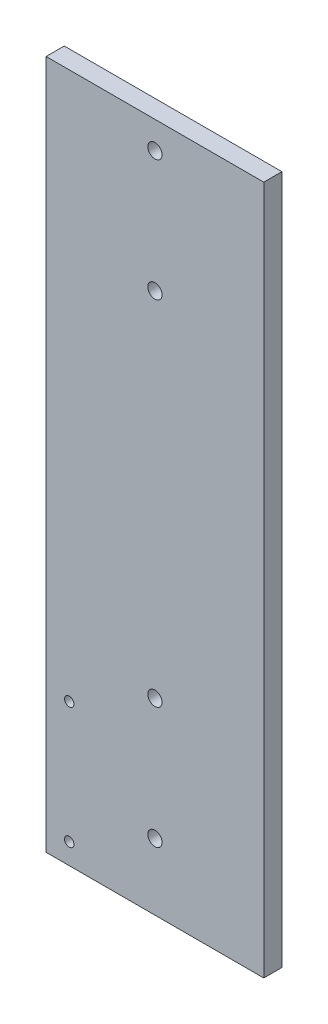
ISO-10303-21;
HEADER;
FILE_DESCRIPTION(('STEP AP214'),'2;1');
FILE_NAME('part.step','',(''),(''),'','','');
FILE_SCHEMA(('AUTOMOTIVE_DESIGN { 1 0 10303 214 1 1 1 1 }'));
ENDSEC;
DATA;
#1=APPLICATION_CONTEXT('core data for automotive mechanical design processes');
#2=APPLICATION_PROTOCOL_DEFINITION('international standard','automotive_design',2000,#1);
#3=PRODUCT_CONTEXT('',#1,'mechanical');
#4=PRODUCT('Part','Part','',(#3));
#5=PRODUCT_RELATED_PRODUCT_CATEGORY('part','',(#4));
#6=PRODUCT_DEFINITION_FORMATION('','',#4);
#7=PRODUCT_DEFINITION_CONTEXT('part definition',#1,'design');
#8=PRODUCT_DEFINITION('design','',#6,#7);
#9=PRODUCT_DEFINITION_SHAPE('','',#8);
#10=(LENGTH_UNIT() NAMED_UNIT(*) SI_UNIT(.MILLI.,.METRE.));
#11=(NAMED_UNIT(*) PLANE_ANGLE_UNIT() SI_UNIT($,.RADIAN.));
#12=(NAMED_UNIT(*) SI_UNIT($,.STERADIAN.) SOLID_ANGLE_UNIT());
#13=UNCERTAINTY_MEASURE_WITH_UNIT(LENGTH_MEASURE(1.E-05),#10,'distance_accuracy_value','');
#14=(GEOMETRIC_REPRESENTATION_CONTEXT(3) GLOBAL_UNCERTAINTY_ASSIGNED_CONTEXT((#13)) GLOBAL_UNIT_ASSIGNED_CONTEXT((#10,
#11,#12)) REPRESENTATION_CONTEXT('',''));
#15=CARTESIAN_POINT('',(0.,0.,0.));
#16=DIRECTION('',(0.,0.,1.));
#17=DIRECTION('',(1.,0.,0.));
#18=AXIS2_PLACEMENT_3D('',#15,#16,#17);
#19=CARTESIAN_POINT('',(-38.1,120.65,6.35));
#20=DIRECTION('',(1.,0.,0.));
#21=DIRECTION('',(0.,1.,0.));
#22=AXIS2_PLACEMENT_3D('',#19,#20,#21);
#23=PLANE('',#22);
#24=DIRECTION('',(0.,-1.,0.));
#25=VECTOR('',#24,1.);
#26=CARTESIAN_POINT('',(-38.1,120.65,0.));
#27=LINE('',#26,#25);
#28=CARTESIAN_POINT('',(-38.1,120.65,0.));
#29=VERTEX_POINT('',#28);
#30=CARTESIAN_POINT('',(-38.1,-120.65,0.));
#31=VERTEX_POINT('',#30);
#32=EDGE_CURVE('E97',#29,#31,#27,.T.);
#33=ORIENTED_EDGE('',*,*,#32,.T.);
#34=DIRECTION('',(0.,0.,-1.));
#35=VECTOR('',#34,1.);
#36=CARTESIAN_POINT('',(-38.1,-120.65,6.35));
#37=LINE('',#36,#35);
#38=CARTESIAN_POINT('',(-38.1,-120.65,6.35));
#39=VERTEX_POINT('',#38);
#40=EDGE_CURVE('E11',#39,#31,#37,.T.);
#41=ORIENTED_EDGE('',*,*,#40,.F.);
#42=DIRECTION('',(0.,-1.,0.));
#43=VECTOR('',#42,1.);
#44=CARTESIAN_POINT('',(-38.1,120.65,6.35));
#45=LINE('',#44,#43);
#46=CARTESIAN_POINT('',(-38.1,120.65,6.35));
#47=VERTEX_POINT('',#46);
#48=EDGE_CURVE('E85',#47,#39,#45,.T.);
#49=ORIENTED_EDGE('',*,*,#48,.F.);
#50=DIRECTION('',(0.,0.,-1.));
#51=VECTOR('',#50,1.);
#52=CARTESIAN_POINT('',(-38.1,120.65,6.35));
#53=LINE('',#52,#51);
#54=EDGE_CURVE('E93',#47,#29,#53,.T.);
#55=ORIENTED_EDGE('',*,*,#54,.T.);
#56=EDGE_LOOP('',(#33,#41,#49,#55));
#57=FACE_BOUND('',#56,.T.);
#58=ADVANCED_FACE('F34',(#57),#23,.F.);
#59=CARTESIAN_POINT('',(38.1,-120.65,6.35));
#60=DIRECTION('',(0.,1.,0.));
#61=DIRECTION('',(0.,0.,1.));
#62=AXIS2_PLACEMENT_3D('',#59,#60,#61);
#63=PLANE('',#62);
#64=DIRECTION('',(1.,0.,0.));
#65=VECTOR('',#64,1.);
#66=CARTESIAN_POINT('',(38.1,-120.65,0.));
#67=LINE('',#66,#65);
#68=CARTESIAN_POINT('',(38.1,-120.65,0.));
#69=VERTEX_POINT('',#68);
#70=EDGE_CURVE('E89',#31,#69,#67,.T.);
#71=ORIENTED_EDGE('',*,*,#70,.T.);
#72=DIRECTION('',(0.,0.,-1.));
#73=VECTOR('',#72,1.);
#74=CARTESIAN_POINT('',(38.1,-120.65,6.35));
#75=LINE('',#74,#73);
#76=CARTESIAN_POINT('',(38.1,-120.65,6.35));
#77=VERTEX_POINT('',#76);
#78=EDGE_CURVE('E42',#77,#69,#75,.T.);
#79=ORIENTED_EDGE('',*,*,#78,.F.);
#80=DIRECTION('',(1.,0.,0.));
#81=VECTOR('',#80,1.);
#82=CARTESIAN_POINT('',(38.1,-120.65,6.35));
#83=LINE('',#82,#81);
#84=EDGE_CURVE('E80',#39,#77,#83,.T.);
#85=ORIENTED_EDGE('',*,*,#84,.F.);
#86=ORIENTED_EDGE('',*,*,#40,.T.);
#87=EDGE_LOOP('',(#71,#79,#85,#86));
#88=FACE_BOUND('',#87,.T.);
#89=ADVANCED_FACE('F88',(#88),#63,.F.);
#90=CARTESIAN_POINT('',(38.1,120.65,6.35));
#91=DIRECTION('',(-1.,0.,0.));
#92=DIRECTION('',(0.,-1.,0.));
#93=AXIS2_PLACEMENT_3D('',#90,#91,#92);
#94=PLANE('',#93);
#95=DIRECTION('',(0.,1.,0.));
#96=VECTOR('',#95,1.);
#97=CARTESIAN_POINT('',(38.1,120.65,0.));
#98=LINE('',#97,#96);
#99=CARTESIAN_POINT('',(38.1,120.65,0.));
#100=VERTEX_POINT('',#99);
#101=EDGE_CURVE('E67',#69,#100,#98,.T.);
#102=ORIENTED_EDGE('',*,*,#101,.T.);
#103=DIRECTION('',(0.,0.,-1.));
#104=VECTOR('',#103,1.);
#105=CARTESIAN_POINT('',(38.1,120.65,6.35));
#106=LINE('',#105,#104);
#107=CARTESIAN_POINT('',(38.1,120.65,6.35));
#108=VERTEX_POINT('',#107);
#109=EDGE_CURVE('E90',#108,#100,#106,.T.);
#110=ORIENTED_EDGE('',*,*,#109,.F.);
#111=DIRECTION('',(0.,1.,0.));
#112=VECTOR('',#111,1.);
#113=CARTESIAN_POINT('',(38.1,120.65,6.35));
#114=LINE('',#113,#112);
#115=EDGE_CURVE('E83',#77,#108,#114,.T.);
#116=ORIENTED_EDGE('',*,*,#115,.F.);
#117=ORIENTED_EDGE('',*,*,#78,.T.);
#118=EDGE_LOOP('',(#102,#110,#116,#117));
#119=FACE_BOUND('',#118,.T.);
#120=ADVANCED_FACE('F91',(#119),#94,.F.);
#121=CARTESIAN_POINT('',(38.1,120.65,6.35));
#122=DIRECTION('',(0.,-1.,0.));
#123=DIRECTION('',(0.,0.,-1.));
#124=AXIS2_PLACEMENT_3D('',#121,#122,#123);
#125=PLANE('',#124);
#126=DIRECTION('',(-1.,0.,0.));
#127=VECTOR('',#126,1.);
#128=CARTESIAN_POINT('',(38.1,120.65,0.));
#129=LINE('',#128,#127);
#130=EDGE_CURVE('E73',#100,#29,#129,.T.);
#131=ORIENTED_EDGE('',*,*,#130,.T.);
#132=ORIENTED_EDGE('',*,*,#54,.F.);
#133=DIRECTION('',(-1.,0.,0.));
#134=VECTOR('',#133,1.);
#135=CARTESIAN_POINT('',(38.1,120.65,6.35));
#136=LINE('',#135,#134);
#137=EDGE_CURVE('E50',#108,#47,#136,.T.);
#138=ORIENTED_EDGE('',*,*,#137,.F.);
#139=ORIENTED_EDGE('',*,*,#109,.T.);
#140=EDGE_LOOP('',(#131,#132,#138,#139));
#141=FACE_BOUND('',#140,.T.);
#142=ADVANCED_FACE('F105',(#141),#125,.F.);
#143=CARTESIAN_POINT('',(0.,0.,6.35));
#144=DIRECTION('',(0.,0.,-1.));
#145=DIRECTION('',(-1.,0.,0.));
#146=AXIS2_PLACEMENT_3D('',#143,#144,#145);
#147=PLANE('',#146);
#148=CARTESIAN_POINT('',(-30.,-70.875,6.35));
#149=DIRECTION('',(0.,0.,1.));
#150=DIRECTION('',(1.,0.,0.));
#151=AXIS2_PLACEMENT_3D('',#148,#149,#150);
#152=CIRCLE('',#151,1.65);
#153=CARTESIAN_POINT('',(-28.35,-70.875,6.35));
#154=VERTEX_POINT('',#153);
#155=EDGE_CURVE('E143',#154,#154,#152,.T.);
#156=ORIENTED_EDGE('',*,*,#155,.F.);
#157=EDGE_LOOP('',(#156));
#158=FACE_BOUND('',#157,.T.);
#159=CARTESIAN_POINT('',(-30.,-113.375,6.35));
#160=DIRECTION('',(0.,0.,1.));
#161=DIRECTION('',(1.,0.,0.));
#162=AXIS2_PLACEMENT_3D('',#159,#160,#161);
#163=CIRCLE('',#162,1.65);
#164=CARTESIAN_POINT('',(-28.35,-113.375,6.35));
#165=VERTEX_POINT('',#164);
#166=EDGE_CURVE('E137',#165,#165,#163,.T.);
#167=ORIENTED_EDGE('',*,*,#166,.F.);
#168=EDGE_LOOP('',(#167));
#169=FACE_BOUND('',#168,.T.);
#170=CARTESIAN_POINT('',(0.,-97.375,6.35));
#171=DIRECTION('',(0.,0.,1.));
#172=DIRECTION('',(1.,0.,0.));
#173=AXIS2_PLACEMENT_3D('',#170,#171,#172);
#174=CIRCLE('',#173,2.49999999999999);
#175=CARTESIAN_POINT('',(2.49999999999997,-97.375,6.35));
#176=VERTEX_POINT('',#175);
#177=EDGE_CURVE('E131',#176,#176,#174,.T.);
#178=ORIENTED_EDGE('',*,*,#177,.F.);
#179=EDGE_LOOP('',(#178));
#180=FACE_BOUND('',#179,.T.);
#181=CARTESIAN_POINT('',(0.,111.125,6.35));
#182=DIRECTION('',(0.,0.,1.));
#183=DIRECTION('',(1.,0.,0.));
#184=AXIS2_PLACEMENT_3D('',#181,#182,#183);
#185=CIRCLE('',#184,2.49999999999999);
#186=CARTESIAN_POINT('',(2.49999999999999,111.125,6.35));
#187=VERTEX_POINT('',#186);
#188=EDGE_CURVE('E125',#187,#187,#185,.T.);
#189=ORIENTED_EDGE('',*,*,#188,.F.);
#190=EDGE_LOOP('',(#189));
#191=FACE_BOUND('',#190,.T.);
#192=CARTESIAN_POINT('',(0.,-54.875,6.35));
#193=DIRECTION('',(0.,0.,1.));
#194=DIRECTION('',(1.,0.,0.));
#195=AXIS2_PLACEMENT_3D('',#192,#193,#194);
#196=CIRCLE('',#195,2.49999999999999);
#197=CARTESIAN_POINT('',(2.49999999999996,-54.875,6.35));
#198=VERTEX_POINT('',#197);
#199=EDGE_CURVE('E119',#198,#198,#196,.T.);
#200=ORIENTED_EDGE('',*,*,#199,.F.);
#201=EDGE_LOOP('',(#200));
#202=FACE_BOUND('',#201,.T.);
#203=CARTESIAN_POINT('',(0.,68.625,6.35));
#204=DIRECTION('',(0.,0.,1.));
#205=DIRECTION('',(1.,0.,0.));
#206=AXIS2_PLACEMENT_3D('',#203,#204,#205);
#207=CIRCLE('',#206,2.49999999999999);
#208=CARTESIAN_POINT('',(2.49999999999999,68.625,6.35));
#209=VERTEX_POINT('',#208);
#210=EDGE_CURVE('E113',#209,#209,#207,.T.);
#211=ORIENTED_EDGE('',*,*,#210,.F.);
#212=EDGE_LOOP('',(#211));
#213=FACE_BOUND('',#212,.T.);
#214=ORIENTED_EDGE('',*,*,#48,.T.);
#215=ORIENTED_EDGE('',*,*,#84,.T.);
#216=ORIENTED_EDGE('',*,*,#115,.T.);
#217=ORIENTED_EDGE('',*,*,#137,.T.);
#218=EDGE_LOOP('',(#214,#215,#216,#217));
#219=FACE_BOUND('',#218,.T.);
#220=ADVANCED_FACE('F81',(#158,#169,#180,#191,#202,#213,#219),#147,.F.);
#221=CARTESIAN_POINT('',(0.,0.,0.));
#222=DIRECTION('',(0.,0.,-1.));
#223=DIRECTION('',(-1.,0.,0.));
#224=AXIS2_PLACEMENT_3D('',#221,#222,#223);
#225=PLANE('',#224);
#226=CARTESIAN_POINT('',(-30.,-70.875,0.));
#227=DIRECTION('',(0.,0.,1.));
#228=DIRECTION('',(1.,0.,0.));
#229=AXIS2_PLACEMENT_3D('',#226,#227,#228);
#230=CIRCLE('',#229,1.65);
#231=CARTESIAN_POINT('',(-28.35,-70.875,0.));
#232=VERTEX_POINT('',#231);
#233=EDGE_CURVE('E140',#232,#232,#230,.T.);
#234=ORIENTED_EDGE('',*,*,#233,.T.);
#235=EDGE_LOOP('',(#234));
#236=FACE_BOUND('',#235,.T.);
#237=CARTESIAN_POINT('',(-30.,-113.375,0.));
#238=DIRECTION('',(0.,0.,1.));
#239=DIRECTION('',(1.,0.,0.));
#240=AXIS2_PLACEMENT_3D('',#237,#238,#239);
#241=CIRCLE('',#240,1.65);
#242=CARTESIAN_POINT('',(-28.35,-113.375,0.));
#243=VERTEX_POINT('',#242);
#244=EDGE_CURVE('E134',#243,#243,#241,.T.);
#245=ORIENTED_EDGE('',*,*,#244,.T.);
#246=EDGE_LOOP('',(#245));
#247=FACE_BOUND('',#246,.T.);
#248=CARTESIAN_POINT('',(0.,-97.375,0.));
#249=DIRECTION('',(0.,0.,1.));
#250=DIRECTION('',(1.,0.,0.));
#251=AXIS2_PLACEMENT_3D('',#248,#249,#250);
#252=CIRCLE('',#251,2.5);
#253=CARTESIAN_POINT('',(2.49999999999997,-97.375,0.));
#254=VERTEX_POINT('',#253);
#255=EDGE_CURVE('E128',#254,#254,#252,.T.);
#256=ORIENTED_EDGE('',*,*,#255,.T.);
#257=EDGE_LOOP('',(#256));
#258=FACE_BOUND('',#257,.T.);
#259=CARTESIAN_POINT('',(0.,111.125,0.));
#260=DIRECTION('',(0.,0.,1.));
#261=DIRECTION('',(1.,0.,0.));
#262=AXIS2_PLACEMENT_3D('',#259,#260,#261);
#263=CIRCLE('',#262,2.5);
#264=CARTESIAN_POINT('',(2.5,111.125,0.));
#265=VERTEX_POINT('',#264);
#266=EDGE_CURVE('E122',#265,#265,#263,.T.);
#267=ORIENTED_EDGE('',*,*,#266,.T.);
#268=EDGE_LOOP('',(#267));
#269=FACE_BOUND('',#268,.T.);
#270=CARTESIAN_POINT('',(0.,-54.875,0.));
#271=DIRECTION('',(0.,0.,1.));
#272=DIRECTION('',(1.,0.,0.));
#273=AXIS2_PLACEMENT_3D('',#270,#271,#272);
#274=CIRCLE('',#273,2.5);
#275=CARTESIAN_POINT('',(2.49999999999997,-54.875,0.));
#276=VERTEX_POINT('',#275);
#277=EDGE_CURVE('E116',#276,#276,#274,.T.);
#278=ORIENTED_EDGE('',*,*,#277,.T.);
#279=EDGE_LOOP('',(#278));
#280=FACE_BOUND('',#279,.T.);
#281=CARTESIAN_POINT('',(0.,68.625,0.));
#282=DIRECTION('',(0.,0.,1.));
#283=DIRECTION('',(1.,0.,0.));
#284=AXIS2_PLACEMENT_3D('',#281,#282,#283);
#285=CIRCLE('',#284,2.5);
#286=CARTESIAN_POINT('',(2.5,68.625,0.));
#287=VERTEX_POINT('',#286);
#288=EDGE_CURVE('E100',#287,#287,#285,.T.);
#289=ORIENTED_EDGE('',*,*,#288,.T.);
#290=EDGE_LOOP('',(#289));
#291=FACE_BOUND('',#290,.T.);
#292=ORIENTED_EDGE('',*,*,#32,.F.);
#293=ORIENTED_EDGE('',*,*,#130,.F.);
#294=ORIENTED_EDGE('',*,*,#101,.F.);
#295=ORIENTED_EDGE('',*,*,#70,.F.);
#296=EDGE_LOOP('',(#292,#293,#294,#295));
#297=FACE_BOUND('',#296,.T.);
#298=ADVANCED_FACE('F108',(#236,#247,#258,#269,#280,#291,#297),#225,.T.);
#299=CARTESIAN_POINT('',(0.,68.625,6.35));
#300=DIRECTION('',(0.,0.,1.));
#301=DIRECTION('',(1.,0.,0.));
#302=AXIS2_PLACEMENT_3D('',#299,#300,#301);
#303=CYLINDRICAL_SURFACE('',#302,2.49999999999999);
#304=ORIENTED_EDGE('',*,*,#288,.F.);
#305=EDGE_LOOP('',(#304));
#306=FACE_BOUND('',#305,.T.);
#307=ORIENTED_EDGE('',*,*,#210,.T.);
#308=EDGE_LOOP('',(#307));
#309=FACE_BOUND('',#308,.T.);
#310=ADVANCED_FACE('F162',(#306,#309),#303,.F.);
#311=CARTESIAN_POINT('',(0.,-54.875,6.35));
#312=DIRECTION('',(0.,0.,1.));
#313=DIRECTION('',(1.,0.,0.));
#314=AXIS2_PLACEMENT_3D('',#311,#312,#313);
#315=CYLINDRICAL_SURFACE('',#314,2.49999999999999);
#316=ORIENTED_EDGE('',*,*,#277,.F.);
#317=EDGE_LOOP('',(#316));
#318=FACE_BOUND('',#317,.T.);
#319=ORIENTED_EDGE('',*,*,#199,.T.);
#320=EDGE_LOOP('',(#319));
#321=FACE_BOUND('',#320,.T.);
#322=ADVANCED_FACE('F164',(#318,#321),#315,.F.);
#323=CARTESIAN_POINT('',(0.,111.125,6.35));
#324=DIRECTION('',(0.,0.,1.));
#325=DIRECTION('',(1.,0.,0.));
#326=AXIS2_PLACEMENT_3D('',#323,#324,#325);
#327=CYLINDRICAL_SURFACE('',#326,2.49999999999999);
#328=ORIENTED_EDGE('',*,*,#266,.F.);
#329=EDGE_LOOP('',(#328));
#330=FACE_BOUND('',#329,.T.);
#331=ORIENTED_EDGE('',*,*,#188,.T.);
#332=EDGE_LOOP('',(#331));
#333=FACE_BOUND('',#332,.T.);
#334=ADVANCED_FACE('F171',(#330,#333),#327,.F.);
#335=CARTESIAN_POINT('',(0.,-97.375,6.35));
#336=DIRECTION('',(0.,0.,1.));
#337=DIRECTION('',(1.,0.,0.));
#338=AXIS2_PLACEMENT_3D('',#335,#336,#337);
#339=CYLINDRICAL_SURFACE('',#338,2.49999999999999);
#340=ORIENTED_EDGE('',*,*,#255,.F.);
#341=EDGE_LOOP('',(#340));
#342=FACE_BOUND('',#341,.T.);
#343=ORIENTED_EDGE('',*,*,#177,.T.);
#344=EDGE_LOOP('',(#343));
#345=FACE_BOUND('',#344,.T.);
#346=ADVANCED_FACE('F213',(#342,#345),#339,.F.);
#347=CARTESIAN_POINT('',(-30.,-113.375,6.35));
#348=DIRECTION('',(0.,0.,1.));
#349=DIRECTION('',(1.,0.,0.));
#350=AXIS2_PLACEMENT_3D('',#347,#348,#349);
#351=CYLINDRICAL_SURFACE('',#350,1.65);
#352=ORIENTED_EDGE('',*,*,#244,.F.);
#353=EDGE_LOOP('',(#352));
#354=FACE_BOUND('',#353,.T.);
#355=ORIENTED_EDGE('',*,*,#166,.T.);
#356=EDGE_LOOP('',(#355));
#357=FACE_BOUND('',#356,.T.);
#358=ADVANCED_FACE('F207',(#354,#357),#351,.F.);
#359=CARTESIAN_POINT('',(-30.,-70.875,6.35));
#360=DIRECTION('',(0.,0.,1.));
#361=DIRECTION('',(1.,0.,0.));
#362=AXIS2_PLACEMENT_3D('',#359,#360,#361);
#363=CYLINDRICAL_SURFACE('',#362,1.65);
#364=ORIENTED_EDGE('',*,*,#233,.F.);
#365=EDGE_LOOP('',(#364));
#366=FACE_BOUND('',#365,.T.);
#367=ORIENTED_EDGE('',*,*,#155,.T.);
#368=EDGE_LOOP('',(#367));
#369=FACE_BOUND('',#368,.T.);
#370=ADVANCED_FACE('F147',(#366,#369),#363,.F.);
#371=CLOSED_SHELL('',(#58,#89,#120,#142,#220,#298,#310,#322,#334,#346,#358,#370));
#372=MANIFOLD_SOLID_BREP('B2',#371);
#373=ADVANCED_BREP_SHAPE_REPRESENTATION('',(#18,#372),#14);
#374=SHAPE_DEFINITION_REPRESENTATION(#9,#373);
ENDSEC;
END-ISO-10303-21;
